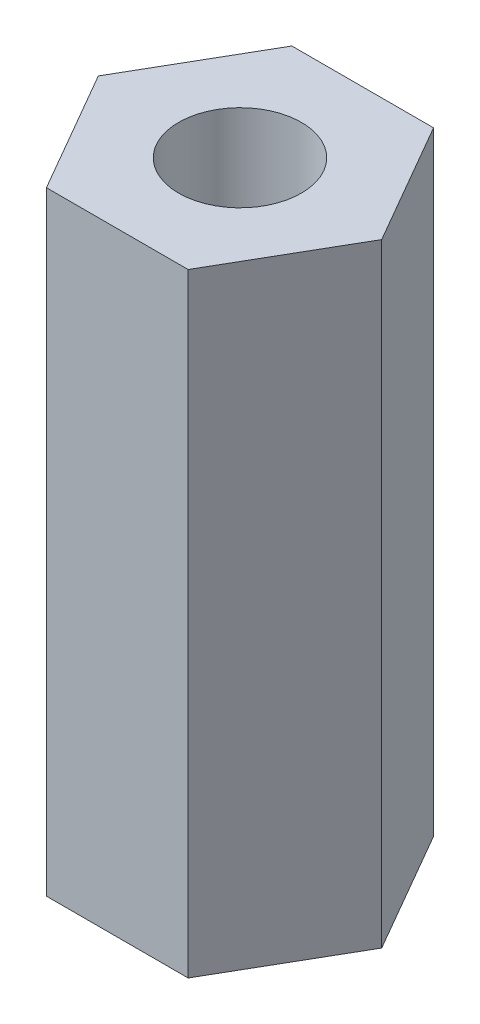
ISO-10303-21;
HEADER;
FILE_DESCRIPTION(('STEP AP214'),'2;1');
FILE_NAME('part.step','',(''),(''),'','','');
FILE_SCHEMA(('AUTOMOTIVE_DESIGN { 1 0 10303 214 1 1 1 1 }'));
ENDSEC;
DATA;
#1=APPLICATION_CONTEXT('core data for automotive mechanical design processes');
#2=APPLICATION_PROTOCOL_DEFINITION('international standard','automotive_design',2000,#1);
#3=PRODUCT_CONTEXT('',#1,'mechanical');
#4=PRODUCT('Part','Part','',(#3));
#5=PRODUCT_RELATED_PRODUCT_CATEGORY('part','',(#4));
#6=PRODUCT_DEFINITION_FORMATION('','',#4);
#7=PRODUCT_DEFINITION_CONTEXT('part definition',#1,'design');
#8=PRODUCT_DEFINITION('design','',#6,#7);
#9=PRODUCT_DEFINITION_SHAPE('','',#8);
#10=(LENGTH_UNIT() NAMED_UNIT(*) SI_UNIT(.MILLI.,.METRE.));
#11=(NAMED_UNIT(*) PLANE_ANGLE_UNIT() SI_UNIT($,.RADIAN.));
#12=(NAMED_UNIT(*) SI_UNIT($,.STERADIAN.) SOLID_ANGLE_UNIT());
#13=UNCERTAINTY_MEASURE_WITH_UNIT(LENGTH_MEASURE(1.E-05),#10,'distance_accuracy_value','');
#14=(GEOMETRIC_REPRESENTATION_CONTEXT(3) GLOBAL_UNCERTAINTY_ASSIGNED_CONTEXT((#13)) GLOBAL_UNIT_ASSIGNED_CONTEXT((#10,
#11,#12)) REPRESENTATION_CONTEXT('',''));
#15=CARTESIAN_POINT('',(0.,0.,0.));
#16=DIRECTION('',(0.,0.,1.));
#17=DIRECTION('',(1.,0.,0.));
#18=AXIS2_PLACEMENT_3D('',#15,#16,#17);
#19=CARTESIAN_POINT('',(0.,31.75,0.));
#20=DIRECTION('',(0.,1.,0.));
#21=DIRECTION('',(0.,0.,1.));
#22=AXIS2_PLACEMENT_3D('',#19,#20,#21);
#23=PLANE('',#22);
#24=DIRECTION('',(0.5,0.,0.866025403784439));
#25=VECTOR('',#24,1.);
#26=CARTESIAN_POINT('',(-7.33234841870825,31.75,0.));
#27=LINE('',#26,#25);
#28=CARTESIAN_POINT('',(-7.33234841870825,31.75,0.));
#29=VERTEX_POINT('',#28);
#30=CARTESIAN_POINT('',(-3.66617420935413,31.75,6.35));
#31=VERTEX_POINT('',#30);
#32=EDGE_CURVE('E137',#29,#31,#27,.T.);
#33=ORIENTED_EDGE('',*,*,#32,.T.);
#34=DIRECTION('',(1.,0.,0.));
#35=VECTOR('',#34,1.);
#36=CARTESIAN_POINT('',(-3.66617420935413,31.75,6.35));
#37=LINE('',#36,#35);
#38=CARTESIAN_POINT('',(3.66617420935412,31.75,6.35));
#39=VERTEX_POINT('',#38);
#40=EDGE_CURVE('E95',#31,#39,#37,.T.);
#41=ORIENTED_EDGE('',*,*,#40,.T.);
#42=DIRECTION('',(0.5,0.,-0.866025403784438));
#43=VECTOR('',#42,1.);
#44=CARTESIAN_POINT('',(3.66617420935412,31.75,6.35));
#45=LINE('',#44,#43);
#46=CARTESIAN_POINT('',(7.33234841870825,31.75,0.));
#47=VERTEX_POINT('',#46);
#48=EDGE_CURVE('E108',#39,#47,#45,.T.);
#49=ORIENTED_EDGE('',*,*,#48,.T.);
#50=DIRECTION('',(-0.499999999999999,0.,-0.866025403784439));
#51=VECTOR('',#50,1.);
#52=CARTESIAN_POINT('',(7.33234841870825,31.75,0.));
#53=LINE('',#52,#51);
#54=CARTESIAN_POINT('',(3.66617420935413,31.75,-6.35));
#55=VERTEX_POINT('',#54);
#56=EDGE_CURVE('E102',#47,#55,#53,.T.);
#57=ORIENTED_EDGE('',*,*,#56,.T.);
#58=DIRECTION('',(-1.,0.,0.));
#59=VECTOR('',#58,1.);
#60=CARTESIAN_POINT('',(3.66617420935413,31.75,-6.35));
#61=LINE('',#60,#59);
#62=CARTESIAN_POINT('',(-3.66617420935412,31.75,-6.35));
#63=VERTEX_POINT('',#62);
#64=EDGE_CURVE('E106',#55,#63,#61,.T.);
#65=ORIENTED_EDGE('',*,*,#64,.T.);
#66=DIRECTION('',(-0.5,0.,0.866025403784438));
#67=VECTOR('',#66,1.);
#68=CARTESIAN_POINT('',(-3.66617420935412,31.75,-6.35));
#69=LINE('',#68,#67);
#70=EDGE_CURVE('E58',#63,#29,#69,.T.);
#71=ORIENTED_EDGE('',*,*,#70,.T.);
#72=EDGE_LOOP('',(#33,#41,#49,#57,#65,#71));
#73=FACE_BOUND('',#72,.T.);
#74=CARTESIAN_POINT('',(0.,31.75,0.));
#75=DIRECTION('',(0.,1.,0.));
#76=DIRECTION('',(0.,0.,1.));
#77=AXIS2_PLACEMENT_3D('',#74,#75,#76);
#78=CIRCLE('',#77,3.175);
#79=CARTESIAN_POINT('',(0.,31.75,3.175));
#80=VERTEX_POINT('',#79);
#81=EDGE_CURVE('E130',#80,#80,#78,.T.);
#82=ORIENTED_EDGE('',*,*,#81,.F.);
#83=EDGE_LOOP('',(#82));
#84=FACE_BOUND('',#83,.T.);
#85=ADVANCED_FACE('F41',(#73,#84),#23,.T.);
#86=CARTESIAN_POINT('',(0.,0.,0.));
#87=DIRECTION('',(0.,1.,0.));
#88=DIRECTION('',(0.,0.,1.));
#89=AXIS2_PLACEMENT_3D('',#86,#87,#88);
#90=PLANE('',#89);
#91=DIRECTION('',(0.5,0.,0.866025403784439));
#92=VECTOR('',#91,1.);
#93=CARTESIAN_POINT('',(-7.33234841870825,0.,0.));
#94=LINE('',#93,#92);
#95=CARTESIAN_POINT('',(-7.33234841870825,0.,0.));
#96=VERTEX_POINT('',#95);
#97=CARTESIAN_POINT('',(-3.66617420935413,0.,6.35));
#98=VERTEX_POINT('',#97);
#99=EDGE_CURVE('E126',#96,#98,#94,.T.);
#100=ORIENTED_EDGE('',*,*,#99,.F.);
#101=DIRECTION('',(-0.5,0.,0.866025403784438));
#102=VECTOR('',#101,1.);
#103=CARTESIAN_POINT('',(-3.66617420935412,0.,-6.35));
#104=LINE('',#103,#102);
#105=CARTESIAN_POINT('',(-3.66617420935412,0.,-6.35));
#106=VERTEX_POINT('',#105);
#107=EDGE_CURVE('E87',#106,#96,#104,.T.);
#108=ORIENTED_EDGE('',*,*,#107,.F.);
#109=DIRECTION('',(-1.,0.,0.));
#110=VECTOR('',#109,1.);
#111=CARTESIAN_POINT('',(3.66617420935413,0.,-6.35));
#112=LINE('',#111,#110);
#113=CARTESIAN_POINT('',(3.66617420935413,0.,-6.35));
#114=VERTEX_POINT('',#113);
#115=EDGE_CURVE('E81',#114,#106,#112,.T.);
#116=ORIENTED_EDGE('',*,*,#115,.F.);
#117=DIRECTION('',(-0.499999999999999,0.,-0.866025403784439));
#118=VECTOR('',#117,1.);
#119=CARTESIAN_POINT('',(7.33234841870825,0.,0.));
#120=LINE('',#119,#118);
#121=CARTESIAN_POINT('',(7.33234841870825,0.,0.));
#122=VERTEX_POINT('',#121);
#123=EDGE_CURVE('E116',#122,#114,#120,.T.);
#124=ORIENTED_EDGE('',*,*,#123,.F.);
#125=DIRECTION('',(0.5,0.,-0.866025403784438));
#126=VECTOR('',#125,1.);
#127=CARTESIAN_POINT('',(3.66617420935412,0.,6.35));
#128=LINE('',#127,#126);
#129=CARTESIAN_POINT('',(3.66617420935412,0.,6.35));
#130=VERTEX_POINT('',#129);
#131=EDGE_CURVE('E132',#130,#122,#128,.T.);
#132=ORIENTED_EDGE('',*,*,#131,.F.);
#133=DIRECTION('',(1.,0.,0.));
#134=VECTOR('',#133,1.);
#135=CARTESIAN_POINT('',(-3.66617420935413,0.,6.35));
#136=LINE('',#135,#134);
#137=EDGE_CURVE('E129',#98,#130,#136,.T.);
#138=ORIENTED_EDGE('',*,*,#137,.F.);
#139=EDGE_LOOP('',(#100,#108,#116,#124,#132,#138));
#140=FACE_BOUND('',#139,.T.);
#141=CARTESIAN_POINT('',(0.,0.,0.));
#142=DIRECTION('',(0.,1.,0.));
#143=DIRECTION('',(0.,0.,1.));
#144=AXIS2_PLACEMENT_3D('',#141,#142,#143);
#145=CIRCLE('',#144,3.175);
#146=CARTESIAN_POINT('',(0.,0.,3.175));
#147=VERTEX_POINT('',#146);
#148=EDGE_CURVE('E234',#147,#147,#145,.T.);
#149=ORIENTED_EDGE('',*,*,#148,.T.);
#150=EDGE_LOOP('',(#149));
#151=FACE_BOUND('',#150,.T.);
#152=ADVANCED_FACE('F148',(#140,#151),#90,.F.);
#153=CARTESIAN_POINT('',(-7.33234841870825,31.75,0.));
#154=DIRECTION('',(0.866025403784439,0.,-0.499999999999999));
#155=DIRECTION('',(-0.5,0.,-0.866025403784439));
#156=AXIS2_PLACEMENT_3D('',#153,#154,#155);
#157=PLANE('',#156);
#158=ORIENTED_EDGE('',*,*,#99,.T.);
#159=DIRECTION('',(0.,-1.,0.));
#160=VECTOR('',#159,1.);
#161=CARTESIAN_POINT('',(-3.66617420935413,31.75,6.35));
#162=LINE('',#161,#160);
#163=EDGE_CURVE('E11',#31,#98,#162,.T.);
#164=ORIENTED_EDGE('',*,*,#163,.F.);
#165=ORIENTED_EDGE('',*,*,#32,.F.);
#166=DIRECTION('',(0.,-1.,0.));
#167=VECTOR('',#166,1.);
#168=CARTESIAN_POINT('',(-7.33234841870825,31.75,0.));
#169=LINE('',#168,#167);
#170=EDGE_CURVE('E122',#29,#96,#169,.T.);
#171=ORIENTED_EDGE('',*,*,#170,.T.);
#172=EDGE_LOOP('',(#158,#164,#165,#171));
#173=FACE_BOUND('',#172,.T.);
#174=ADVANCED_FACE('F43',(#173),#157,.F.);
#175=CARTESIAN_POINT('',(-3.66617420935413,31.75,6.35));
#176=DIRECTION('',(0.,0.,-1.));
#177=DIRECTION('',(-1.,0.,0.));
#178=AXIS2_PLACEMENT_3D('',#175,#176,#177);
#179=PLANE('',#178);
#180=ORIENTED_EDGE('',*,*,#137,.T.);
#181=DIRECTION('',(0.,-1.,0.));
#182=VECTOR('',#181,1.);
#183=CARTESIAN_POINT('',(3.66617420935412,31.75,6.35));
#184=LINE('',#183,#182);
#185=EDGE_CURVE('E50',#39,#130,#184,.T.);
#186=ORIENTED_EDGE('',*,*,#185,.F.);
#187=ORIENTED_EDGE('',*,*,#40,.F.);
#188=ORIENTED_EDGE('',*,*,#163,.T.);
#189=EDGE_LOOP('',(#180,#186,#187,#188));
#190=FACE_BOUND('',#189,.T.);
#191=ADVANCED_FACE('F173',(#190),#179,.F.);
#192=CARTESIAN_POINT('',(3.66617420935412,31.75,6.35));
#193=DIRECTION('',(-0.866025403784438,0.,-0.5));
#194=DIRECTION('',(-0.5,0.,0.866025403784439));
#195=AXIS2_PLACEMENT_3D('',#192,#193,#194);
#196=PLANE('',#195);
#197=ORIENTED_EDGE('',*,*,#131,.T.);
#198=DIRECTION('',(0.,-1.,0.));
#199=VECTOR('',#198,1.);
#200=CARTESIAN_POINT('',(7.33234841870825,31.75,0.));
#201=LINE('',#200,#199);
#202=EDGE_CURVE('E117',#47,#122,#201,.T.);
#203=ORIENTED_EDGE('',*,*,#202,.F.);
#204=ORIENTED_EDGE('',*,*,#48,.F.);
#205=ORIENTED_EDGE('',*,*,#185,.T.);
#206=EDGE_LOOP('',(#197,#203,#204,#205));
#207=FACE_BOUND('',#206,.T.);
#208=ADVANCED_FACE('F145',(#207),#196,.F.);
#209=CARTESIAN_POINT('',(7.33234841870825,31.75,0.));
#210=DIRECTION('',(-0.866025403784439,0.,0.499999999999999));
#211=DIRECTION('',(0.499999999999999,0.,0.866025403784439));
#212=AXIS2_PLACEMENT_3D('',#209,#210,#211);
#213=PLANE('',#212);
#214=ORIENTED_EDGE('',*,*,#123,.T.);
#215=DIRECTION('',(0.,-1.,0.));
#216=VECTOR('',#215,1.);
#217=CARTESIAN_POINT('',(3.66617420935413,31.75,-6.35));
#218=LINE('',#217,#216);
#219=EDGE_CURVE('E113',#55,#114,#218,.T.);
#220=ORIENTED_EDGE('',*,*,#219,.F.);
#221=ORIENTED_EDGE('',*,*,#56,.F.);
#222=ORIENTED_EDGE('',*,*,#202,.T.);
#223=EDGE_LOOP('',(#214,#220,#221,#222));
#224=FACE_BOUND('',#223,.T.);
#225=ADVANCED_FACE('F114',(#224),#213,.F.);
#226=CARTESIAN_POINT('',(3.66617420935413,31.75,-6.35));
#227=DIRECTION('',(0.,0.,1.));
#228=DIRECTION('',(1.,0.,0.));
#229=AXIS2_PLACEMENT_3D('',#226,#227,#228);
#230=PLANE('',#229);
#231=ORIENTED_EDGE('',*,*,#115,.T.);
#232=DIRECTION('',(0.,-1.,0.));
#233=VECTOR('',#232,1.);
#234=CARTESIAN_POINT('',(-3.66617420935412,31.75,-6.35));
#235=LINE('',#234,#233);
#236=EDGE_CURVE('E118',#63,#106,#235,.T.);
#237=ORIENTED_EDGE('',*,*,#236,.F.);
#238=ORIENTED_EDGE('',*,*,#64,.F.);
#239=ORIENTED_EDGE('',*,*,#219,.T.);
#240=EDGE_LOOP('',(#231,#237,#238,#239));
#241=FACE_BOUND('',#240,.T.);
#242=ADVANCED_FACE('F120',(#241),#230,.F.);
#243=CARTESIAN_POINT('',(-3.66617420935412,31.75,-6.35));
#244=DIRECTION('',(0.866025403784438,0.,0.5));
#245=DIRECTION('',(0.5,0.,-0.866025403784439));
#246=AXIS2_PLACEMENT_3D('',#243,#244,#245);
#247=PLANE('',#246);
#248=ORIENTED_EDGE('',*,*,#107,.T.);
#249=ORIENTED_EDGE('',*,*,#170,.F.);
#250=ORIENTED_EDGE('',*,*,#70,.F.);
#251=ORIENTED_EDGE('',*,*,#236,.T.);
#252=EDGE_LOOP('',(#248,#249,#250,#251));
#253=FACE_BOUND('',#252,.T.);
#254=ADVANCED_FACE('F153',(#253),#247,.F.);
#255=CARTESIAN_POINT('',(0.,31.75,0.));
#256=DIRECTION('',(0.,-1.,0.));
#257=DIRECTION('',(0.,0.,-1.));
#258=AXIS2_PLACEMENT_3D('',#255,#256,#257);
#259=CYLINDRICAL_SURFACE('',#258,3.175);
#260=ORIENTED_EDGE('',*,*,#81,.T.);
#261=EDGE_LOOP('',(#260));
#262=FACE_BOUND('',#261,.T.);
#263=ORIENTED_EDGE('',*,*,#148,.F.);
#264=EDGE_LOOP('',(#263));
#265=FACE_BOUND('',#264,.T.);
#266=ADVANCED_FACE('F155',(#262,#265),#259,.F.);
#267=CLOSED_SHELL('',(#85,#152,#174,#191,#208,#225,#242,#254,#266));
#268=MANIFOLD_SOLID_BREP('B2',#267);
#269=ADVANCED_BREP_SHAPE_REPRESENTATION('',(#18,#268),#14);
#270=SHAPE_DEFINITION_REPRESENTATION(#9,#269);
ENDSEC;
END-ISO-10303-21;
